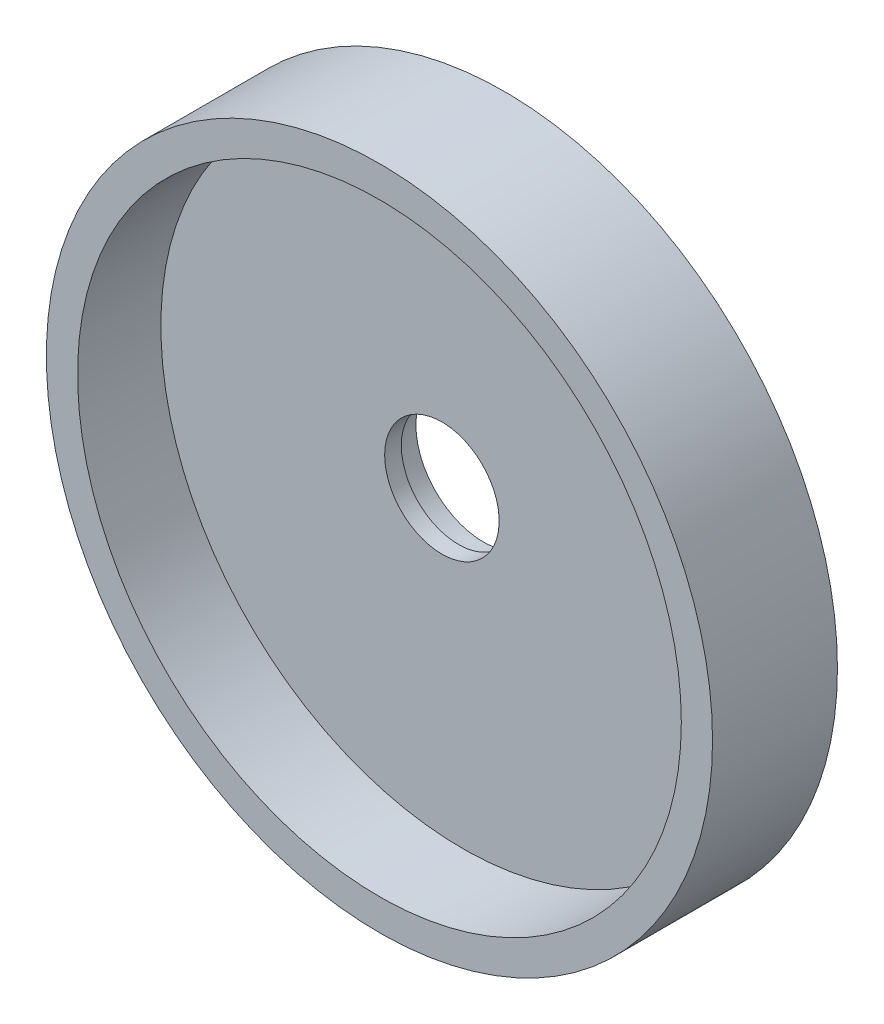
ISO-10303-21;
HEADER;
FILE_DESCRIPTION(('STEP AP214'),'2;1');
FILE_NAME('part.step','',(''),(''),'','','');
FILE_SCHEMA(('AUTOMOTIVE_DESIGN { 1 0 10303 214 1 1 1 1 }'));
ENDSEC;
DATA;
#1=APPLICATION_CONTEXT('core data for automotive mechanical design processes');
#2=APPLICATION_PROTOCOL_DEFINITION('international standard','automotive_design',2000,#1);
#3=PRODUCT_CONTEXT('',#1,'mechanical');
#4=PRODUCT('Part','Part','',(#3));
#5=PRODUCT_RELATED_PRODUCT_CATEGORY('part','',(#4));
#6=PRODUCT_DEFINITION_FORMATION('','',#4);
#7=PRODUCT_DEFINITION_CONTEXT('part definition',#1,'design');
#8=PRODUCT_DEFINITION('design','',#6,#7);
#9=PRODUCT_DEFINITION_SHAPE('','',#8);
#10=(LENGTH_UNIT() NAMED_UNIT(*) SI_UNIT(.MILLI.,.METRE.));
#11=(NAMED_UNIT(*) PLANE_ANGLE_UNIT() SI_UNIT($,.RADIAN.));
#12=(NAMED_UNIT(*) SI_UNIT($,.STERADIAN.) SOLID_ANGLE_UNIT());
#13=UNCERTAINTY_MEASURE_WITH_UNIT(LENGTH_MEASURE(1.E-05),#10,'distance_accuracy_value','');
#14=(GEOMETRIC_REPRESENTATION_CONTEXT(3) GLOBAL_UNCERTAINTY_ASSIGNED_CONTEXT((#13)) GLOBAL_UNIT_ASSIGNED_CONTEXT((#10,
#11,#12)) REPRESENTATION_CONTEXT('',''));
#15=CARTESIAN_POINT('',(0.,0.,0.));
#16=DIRECTION('',(0.,0.,1.));
#17=DIRECTION('',(1.,0.,0.));
#18=AXIS2_PLACEMENT_3D('',#15,#16,#17);
#19=CARTESIAN_POINT('',(-1.,0.,2.));
#20=DIRECTION('',(0.,0.,-1.));
#21=DIRECTION('',(-1.,0.,0.));
#22=AXIS2_PLACEMENT_3D('',#19,#20,#21);
#23=CYLINDRICAL_SURFACE('',#22,2.75);
#24=CARTESIAN_POINT('',(-1.,0.,2.));
#25=DIRECTION('',(0.,0.,-1.));
#26=DIRECTION('',(-1.,0.,0.));
#27=AXIS2_PLACEMENT_3D('',#24,#25,#26);
#28=CIRCLE('',#27,2.75);
#29=CARTESIAN_POINT('',(-3.75,0.,2.));
#30=VERTEX_POINT('',#29);
#31=EDGE_CURVE('E57',#30,#30,#28,.T.);
#32=ORIENTED_EDGE('',*,*,#31,.F.);
#33=EDGE_LOOP('',(#32));
#34=FACE_BOUND('',#33,.T.);
#35=CARTESIAN_POINT('',(-1.,0.,1.2));
#36=DIRECTION('',(0.,0.,-1.));
#37=DIRECTION('',(-1.,0.,0.));
#38=AXIS2_PLACEMENT_3D('',#35,#36,#37);
#39=CIRCLE('',#38,2.75);
#40=CARTESIAN_POINT('',(-3.75,0.,1.2));
#41=VERTEX_POINT('',#40);
#42=EDGE_CURVE('E55',#41,#41,#39,.F.);
#43=ORIENTED_EDGE('',*,*,#42,.F.);
#44=EDGE_LOOP('',(#43));
#45=FACE_BOUND('',#44,.T.);
#46=ADVANCED_FACE('F37',(#34,#45),#23,.F.);
#47=CARTESIAN_POINT('',(0.,0.,6.));
#48=DIRECTION('',(0.,0.,-1.));
#49=DIRECTION('',(-1.,0.,0.));
#50=AXIS2_PLACEMENT_3D('',#47,#48,#49);
#51=CYLINDRICAL_SURFACE('',#50,16.);
#52=CARTESIAN_POINT('',(0.,0.,6.));
#53=DIRECTION('',(0.,0.,1.));
#54=DIRECTION('',(1.,0.,0.));
#55=AXIS2_PLACEMENT_3D('',#52,#53,#54);
#56=CIRCLE('',#55,16.);
#57=CARTESIAN_POINT('',(16.,0.,6.));
#58=VERTEX_POINT('',#57);
#59=EDGE_CURVE('E10',#58,#58,#56,.T.);
#60=ORIENTED_EDGE('',*,*,#59,.F.);
#61=EDGE_LOOP('',(#60));
#62=FACE_BOUND('',#61,.T.);
#63=CARTESIAN_POINT('',(0.,0.,0.));
#64=DIRECTION('',(0.,0.,1.));
#65=DIRECTION('',(1.,0.,0.));
#66=AXIS2_PLACEMENT_3D('',#63,#64,#65);
#67=CIRCLE('',#66,16.);
#68=CARTESIAN_POINT('',(16.,0.,0.));
#69=VERTEX_POINT('',#68);
#70=EDGE_CURVE('E45',#69,#69,#67,.T.);
#71=ORIENTED_EDGE('',*,*,#70,.T.);
#72=EDGE_LOOP('',(#71));
#73=FACE_BOUND('',#72,.T.);
#74=ADVANCED_FACE('F81',(#62,#73),#51,.T.);
#75=CARTESIAN_POINT('',(0.,0.,6.));
#76=DIRECTION('',(0.,0.,1.));
#77=DIRECTION('',(1.,0.,0.));
#78=AXIS2_PLACEMENT_3D('',#75,#76,#77);
#79=PLANE('',#78);
#80=CARTESIAN_POINT('',(0.,0.,6.));
#81=DIRECTION('',(0.,0.,1.));
#82=DIRECTION('',(1.,0.,0.));
#83=AXIS2_PLACEMENT_3D('',#80,#81,#82);
#84=CIRCLE('',#83,14.5);
#85=CARTESIAN_POINT('',(14.5,0.,6.));
#86=VERTEX_POINT('',#85);
#87=EDGE_CURVE('E53',#86,#86,#84,.T.);
#88=ORIENTED_EDGE('',*,*,#87,.F.);
#89=EDGE_LOOP('',(#88));
#90=FACE_BOUND('',#89,.T.);
#91=ORIENTED_EDGE('',*,*,#59,.T.);
#92=EDGE_LOOP('',(#91));
#93=FACE_BOUND('',#92,.T.);
#94=ADVANCED_FACE('F78',(#90,#93),#79,.T.);
#95=CARTESIAN_POINT('',(0.,0.,0.));
#96=DIRECTION('',(0.,0.,1.));
#97=DIRECTION('',(1.,0.,0.));
#98=AXIS2_PLACEMENT_3D('',#95,#96,#97);
#99=PLANE('',#98);
#100=CARTESIAN_POINT('',(-1.,0.,0.));
#101=DIRECTION('',(0.,0.,-1.));
#102=DIRECTION('',(-1.,0.,0.));
#103=AXIS2_PLACEMENT_3D('',#100,#101,#102);
#104=CIRCLE('',#103,3.25);
#105=CARTESIAN_POINT('',(-4.25,0.,0.));
#106=VERTEX_POINT('',#105);
#107=EDGE_CURVE('E63',#106,#106,#104,.T.);
#108=ORIENTED_EDGE('',*,*,#107,.F.);
#109=EDGE_LOOP('',(#108));
#110=FACE_BOUND('',#109,.T.);
#111=ORIENTED_EDGE('',*,*,#70,.F.);
#112=EDGE_LOOP('',(#111));
#113=FACE_BOUND('',#112,.T.);
#114=ADVANCED_FACE('F80',(#110,#113),#99,.F.);
#115=CARTESIAN_POINT('',(0.,0.,2.));
#116=DIRECTION('',(0.,0.,1.));
#117=DIRECTION('',(1.,0.,0.));
#118=AXIS2_PLACEMENT_3D('',#115,#116,#117);
#119=CYLINDRICAL_SURFACE('',#118,14.5);
#120=CARTESIAN_POINT('',(0.,0.,2.));
#121=DIRECTION('',(0.,0.,1.));
#122=DIRECTION('',(1.,0.,0.));
#123=AXIS2_PLACEMENT_3D('',#120,#121,#122);
#124=CIRCLE('',#123,14.5);
#125=CARTESIAN_POINT('',(14.5,0.,2.));
#126=VERTEX_POINT('',#125);
#127=EDGE_CURVE('E50',#126,#126,#124,.T.);
#128=ORIENTED_EDGE('',*,*,#127,.F.);
#129=EDGE_LOOP('',(#128));
#130=FACE_BOUND('',#129,.T.);
#131=ORIENTED_EDGE('',*,*,#87,.T.);
#132=EDGE_LOOP('',(#131));
#133=FACE_BOUND('',#132,.T.);
#134=ADVANCED_FACE('F76',(#130,#133),#119,.F.);
#135=CARTESIAN_POINT('',(0.,0.,2.));
#136=DIRECTION('',(0.,0.,1.));
#137=DIRECTION('',(1.,0.,0.));
#138=AXIS2_PLACEMENT_3D('',#135,#136,#137);
#139=PLANE('',#138);
#140=ORIENTED_EDGE('',*,*,#31,.T.);
#141=EDGE_LOOP('',(#140));
#142=FACE_BOUND('',#141,.T.);
#143=ORIENTED_EDGE('',*,*,#127,.T.);
#144=EDGE_LOOP('',(#143));
#145=FACE_BOUND('',#144,.T.);
#146=ADVANCED_FACE('F101',(#142,#145),#139,.T.);
#147=CARTESIAN_POINT('',(-1.,0.,1.2));
#148=DIRECTION('',(0.,0.,-1.));
#149=DIRECTION('',(-1.,0.,0.));
#150=AXIS2_PLACEMENT_3D('',#147,#148,#149);
#151=PLANE('',#150);
#152=CARTESIAN_POINT('',(-1.,0.,1.2));
#153=DIRECTION('',(0.,0.,-1.));
#154=DIRECTION('',(-1.,0.,0.));
#155=AXIS2_PLACEMENT_3D('',#152,#153,#154);
#156=CIRCLE('',#155,3.18711066486035);
#157=CARTESIAN_POINT('',(-4.18711066486035,0.,1.2));
#158=VERTEX_POINT('',#157);
#159=EDGE_CURVE('E41',#158,#158,#156,.T.);
#160=ORIENTED_EDGE('',*,*,#159,.T.);
#161=EDGE_LOOP('',(#160));
#162=FACE_BOUND('',#161,.T.);
#163=ORIENTED_EDGE('',*,*,#42,.T.);
#164=EDGE_LOOP('',(#163));
#165=FACE_BOUND('',#164,.T.);
#166=ADVANCED_FACE('F100',(#162,#165),#151,.T.);
#167=CARTESIAN_POINT('',(-1.,0.,0.));
#168=DIRECTION('',(0.,0.,-1.));
#169=DIRECTION('',(-1.,0.,0.));
#170=AXIS2_PLACEMENT_3D('',#167,#168,#169);
#171=CONICAL_SURFACE('',#170,3.25,0.05235987755983);
#172=ORIENTED_EDGE('',*,*,#159,.F.);
#173=EDGE_LOOP('',(#172));
#174=FACE_BOUND('',#173,.T.);
#175=ORIENTED_EDGE('',*,*,#107,.T.);
#176=EDGE_LOOP('',(#175));
#177=FACE_BOUND('',#176,.T.);
#178=ADVANCED_FACE('F39',(#174,#177),#171,.F.);
#179=CLOSED_SHELL('',(#46,#74,#94,#114,#134,#146,#166,#178));
#180=MANIFOLD_SOLID_BREP('B2',#179);
#181=ADVANCED_BREP_SHAPE_REPRESENTATION('',(#18,#180),#14);
#182=SHAPE_DEFINITION_REPRESENTATION(#9,#181);
ENDSEC;
END-ISO-10303-21;
